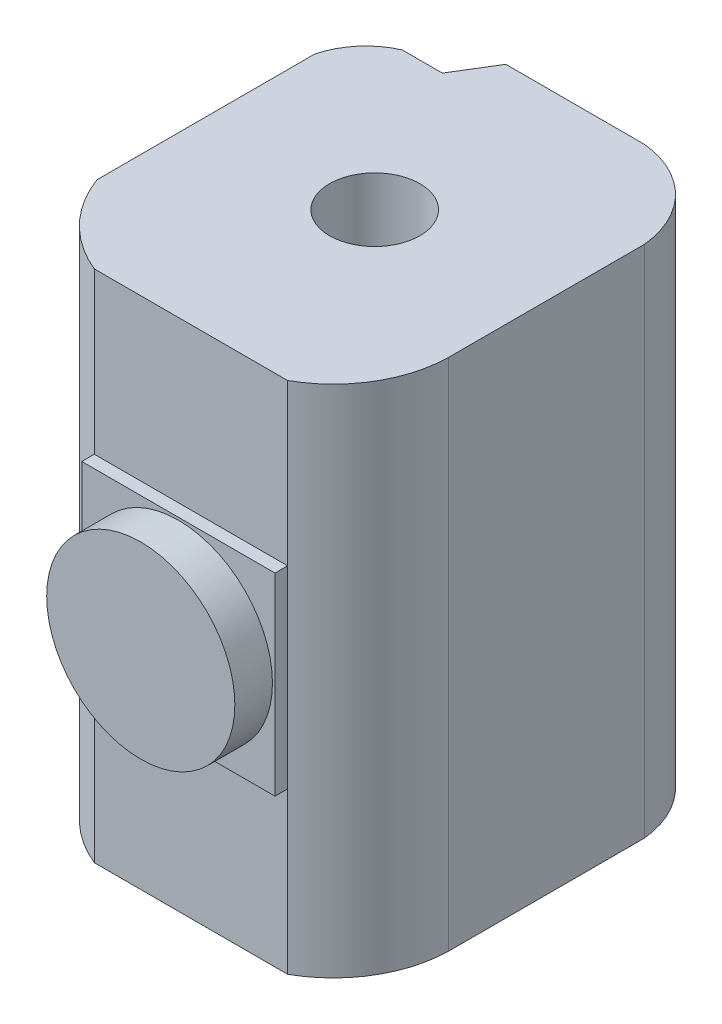
ISO-10303-21;
HEADER;
FILE_DESCRIPTION(('STEP AP214'),'2;1');
FILE_NAME('part.step','',(''),(''),'','','');
FILE_SCHEMA(('AUTOMOTIVE_DESIGN { 1 0 10303 214 1 1 1 1 }'));
ENDSEC;
DATA;
#1=APPLICATION_CONTEXT('core data for automotive mechanical design processes');
#2=APPLICATION_PROTOCOL_DEFINITION('international standard','automotive_design',2000,#1);
#3=PRODUCT_CONTEXT('',#1,'mechanical');
#4=PRODUCT('Part','Part','',(#3));
#5=PRODUCT_RELATED_PRODUCT_CATEGORY('part','',(#4));
#6=PRODUCT_DEFINITION_FORMATION('','',#4);
#7=PRODUCT_DEFINITION_CONTEXT('part definition',#1,'design');
#8=PRODUCT_DEFINITION('design','',#6,#7);
#9=PRODUCT_DEFINITION_SHAPE('','',#8);
#10=(LENGTH_UNIT() NAMED_UNIT(*) SI_UNIT(.MILLI.,.METRE.));
#11=(NAMED_UNIT(*) PLANE_ANGLE_UNIT() SI_UNIT($,.RADIAN.));
#12=(NAMED_UNIT(*) SI_UNIT($,.STERADIAN.) SOLID_ANGLE_UNIT());
#13=UNCERTAINTY_MEASURE_WITH_UNIT(LENGTH_MEASURE(1.E-05),#10,'distance_accuracy_value','');
#14=(GEOMETRIC_REPRESENTATION_CONTEXT(3) GLOBAL_UNCERTAINTY_ASSIGNED_CONTEXT((#13)) GLOBAL_UNIT_ASSIGNED_CONTEXT((#10,
#11,#12)) REPRESENTATION_CONTEXT('',''));
#15=CARTESIAN_POINT('',(0.,0.,0.));
#16=DIRECTION('',(0.,0.,1.));
#17=DIRECTION('',(1.,0.,0.));
#18=AXIS2_PLACEMENT_3D('',#15,#16,#17);
#19=CARTESIAN_POINT('',(-131.4,410.,152.64));
#20=DIRECTION('',(0.,0.,-1.));
#21=DIRECTION('',(-1.,0.,0.));
#22=AXIS2_PLACEMENT_3D('',#19,#20,#21);
#23=PLANE('',#22);
#24=DIRECTION('',(1.,0.,0.));
#25=VECTOR('',#24,1.);
#26=CARTESIAN_POINT('',(-70.92,127.96,152.64));
#27=LINE('',#26,#25);
#28=CARTESIAN_POINT('',(-70.92,127.96,152.64));
#29=VERTEX_POINT('',#28);
#30=CARTESIAN_POINT('',(83.16,127.96,152.64));
#31=VERTEX_POINT('',#30);
#32=EDGE_CURVE('E55',#29,#31,#27,.T.);
#33=ORIENTED_EDGE('',*,*,#32,.F.);
#34=DIRECTION('',(0.,1.,0.));
#35=VECTOR('',#34,1.);
#36=CARTESIAN_POINT('',(-70.92,0.,152.64));
#37=LINE('',#36,#35);
#38=CARTESIAN_POINT('',(-70.92,0.,152.64));
#39=VERTEX_POINT('',#38);
#40=EDGE_CURVE('E217',#39,#29,#37,.T.);
#41=ORIENTED_EDGE('',*,*,#40,.F.);
#42=DIRECTION('',(1.,0.,0.));
#43=VECTOR('',#42,1.);
#44=CARTESIAN_POINT('',(-131.4,0.,152.64));
#45=LINE('',#44,#43);
#46=CARTESIAN_POINT('',(83.16,0.,152.64));
#47=VERTEX_POINT('',#46);
#48=EDGE_CURVE('E234',#39,#47,#45,.T.);
#49=ORIENTED_EDGE('',*,*,#48,.T.);
#50=DIRECTION('',(0.,1.,0.));
#51=VECTOR('',#50,1.);
#52=CARTESIAN_POINT('',(83.16,0.,152.64));
#53=LINE('',#52,#51);
#54=EDGE_CURVE('E186',#47,#31,#53,.T.);
#55=ORIENTED_EDGE('',*,*,#54,.T.);
#56=EDGE_LOOP('',(#33,#41,#49,#55));
#57=FACE_BOUND('',#56,.T.);
#58=ADVANCED_FACE('F38',(#57),#23,.F.);
#59=DIRECTION('',(-1.,0.,0.));
#60=VECTOR('',#59,1.);
#61=CARTESIAN_POINT('',(-70.92,282.04,152.64));
#62=LINE('',#61,#60);
#63=CARTESIAN_POINT('',(83.16,282.04,152.64));
#64=VERTEX_POINT('',#63);
#65=CARTESIAN_POINT('',(-70.92,282.04,152.64));
#66=VERTEX_POINT('',#65);
#67=EDGE_CURVE('E63',#64,#66,#62,.T.);
#68=ORIENTED_EDGE('',*,*,#67,.F.);
#69=CARTESIAN_POINT('',(83.16,410.,152.64));
#70=VERTEX_POINT('',#69);
#71=EDGE_CURVE('E185',#64,#70,#53,.T.);
#72=ORIENTED_EDGE('',*,*,#71,.T.);
#73=DIRECTION('',(1.,0.,0.));
#74=VECTOR('',#73,1.);
#75=CARTESIAN_POINT('',(-131.4,410.,152.64));
#76=LINE('',#75,#74);
#77=CARTESIAN_POINT('',(-70.92,410.,152.64));
#78=VERTEX_POINT('',#77);
#79=EDGE_CURVE('E47',#78,#70,#76,.T.);
#80=ORIENTED_EDGE('',*,*,#79,.F.);
#81=EDGE_CURVE('E216',#66,#78,#37,.T.);
#82=ORIENTED_EDGE('',*,*,#81,.F.);
#83=EDGE_LOOP('',(#68,#72,#80,#82));
#84=FACE_BOUND('',#83,.T.);
#85=ADVANCED_FACE('F282',(#84),#23,.F.);
#86=CARTESIAN_POINT('',(0.,410.,0.));
#87=DIRECTION('',(0.,-1.,0.));
#88=DIRECTION('',(0.,0.,-1.));
#89=AXIS2_PLACEMENT_3D('',#86,#87,#88);
#90=PLANE('',#89);
#91=CARTESIAN_POINT('',(0.,410.,0.));
#92=DIRECTION('',(0.,-1.,0.));
#93=DIRECTION('',(0.,0.,-1.));
#94=AXIS2_PLACEMENT_3D('',#91,#92,#93);
#95=CIRCLE('',#94,36.);
#96=CARTESIAN_POINT('',(0.,410.,36.));
#97=VERTEX_POINT('',#96);
#98=EDGE_CURVE('E170',#97,#97,#95,.T.);
#99=ORIENTED_EDGE('',*,*,#98,.T.);
#100=EDGE_LOOP('',(#99));
#101=FACE_BOUND('',#100,.T.);
#102=DIRECTION('',(-1.,0.,0.));
#103=VECTOR('',#102,1.);
#104=CARTESIAN_POINT('',(-131.4,410.,-152.64));
#105=LINE('',#104,#103);
#106=CARTESIAN_POINT('',(62.2799999999994,410.,-152.64));
#107=VERTEX_POINT('',#106);
#108=CARTESIAN_POINT('',(-48.1593420898172,410.,-152.64));
#109=VERTEX_POINT('',#108);
#110=EDGE_CURVE('E233',#107,#109,#105,.T.);
#111=ORIENTED_EDGE('',*,*,#110,.T.);
#112=DIRECTION('',(-0.52196564210467,0.,0.852966510750721));
#113=VECTOR('',#112,1.);
#114=CARTESIAN_POINT('',(-102.996679913968,410.,-63.027947156597));
#115=LINE('',#114,#113);
#116=CARTESIAN_POINT('',(-67.3454683106027,410.,-121.287125754525));
#117=VERTEX_POINT('',#116);
#118=EDGE_CURVE('E226',#109,#117,#115,.T.);
#119=ORIENTED_EDGE('',*,*,#118,.T.);
#120=DIRECTION('',(-1.,0.,0.));
#121=VECTOR('',#120,1.);
#122=CARTESIAN_POINT('',(0.,410.,-121.287125754525));
#123=LINE('',#122,#121);
#124=CARTESIAN_POINT('',(-99.3727341553014,410.,-121.287125754525));
#125=VERTEX_POINT('',#124);
#126=EDGE_CURVE('E223',#117,#125,#123,.T.);
#127=ORIENTED_EDGE('',*,*,#126,.T.);
#128=CARTESIAN_POINT('',(-76.5886532674374,410.,-69.5023380807909));
#129=DIRECTION('',(0.,1.,0.));
#130=DIRECTION('',(0.,0.,1.));
#131=AXIS2_PLACEMENT_3D('',#128,#129,#130);
#132=CIRCLE('',#131,56.5754237838167);
#133=CARTESIAN_POINT('',(-131.4,410.,-83.52));
#134=VERTEX_POINT('',#133);
#135=EDGE_CURVE('E42',#134,#125,#132,.F.);
#136=ORIENTED_EDGE('',*,*,#135,.F.);
#137=DIRECTION('',(0.,0.,1.));
#138=VECTOR('',#137,1.);
#139=CARTESIAN_POINT('',(-131.4,410.,152.64));
#140=LINE('',#139,#138);
#141=CARTESIAN_POINT('',(-131.4,410.,90.));
#142=VERTEX_POINT('',#141);
#143=EDGE_CURVE('E237',#134,#142,#140,.T.);
#144=ORIENTED_EDGE('',*,*,#143,.T.);
#145=CARTESIAN_POINT('',(-30.0902527311731,410.,52.7009336714775));
#146=DIRECTION('',(0.,1.,0.));
#147=DIRECTION('',(0.,0.,1.));
#148=AXIS2_PLACEMENT_3D('',#145,#146,#147);
#149=CIRCLE('',#148,107.957793793005);
#150=EDGE_CURVE('E222',#78,#142,#149,.F.);
#151=ORIENTED_EDGE('',*,*,#150,.F.);
#152=ORIENTED_EDGE('',*,*,#79,.T.);
#153=CARTESIAN_POINT('',(37.7003567408536,410.,70.681476591326));
#154=DIRECTION('',(0.,1.,0.));
#155=DIRECTION('',(0.,0.,1.));
#156=AXIS2_PLACEMENT_3D('',#153,#154,#155);
#157=CIRCLE('',#156,93.721815627841);
#158=CARTESIAN_POINT('',(131.4,410.,72.7200000000003));
#159=VERTEX_POINT('',#158);
#160=EDGE_CURVE('E253',#159,#70,#157,.F.);
#161=ORIENTED_EDGE('',*,*,#160,.F.);
#162=DIRECTION('',(0.,0.,-1.));
#163=VECTOR('',#162,1.);
#164=CARTESIAN_POINT('',(131.4,410.,152.64));
#165=LINE('',#164,#163);
#166=CARTESIAN_POINT('',(131.4,410.,-83.5200000000001));
#167=VERTEX_POINT('',#166);
#168=EDGE_CURVE('E230',#159,#167,#165,.T.);
#169=ORIENTED_EDGE('',*,*,#168,.T.);
#170=CARTESIAN_POINT('',(55.0799999999997,410.,-76.3199999999996));
#171=DIRECTION('',(0.,1.,0.));
#172=DIRECTION('',(0.,0.,1.));
#173=AXIS2_PLACEMENT_3D('',#170,#171,#172);
#174=CIRCLE('',#173,76.6588703282279);
#175=EDGE_CURVE('E255',#107,#167,#174,.F.);
#176=ORIENTED_EDGE('',*,*,#175,.F.);
#177=EDGE_LOOP('',(#111,#119,#127,#136,#144,#151,#152,#161,#169,#176));
#178=FACE_BOUND('',#177,.T.);
#179=ADVANCED_FACE('F266',(#101,#178),#90,.F.);
#180=CARTESIAN_POINT('',(0.,0.,0.));
#181=DIRECTION('',(0.,-1.,0.));
#182=DIRECTION('',(0.,0.,-1.));
#183=AXIS2_PLACEMENT_3D('',#180,#181,#182);
#184=PLANE('',#183);
#185=CARTESIAN_POINT('',(0.,0.,0.));
#186=DIRECTION('',(0.,1.,0.));
#187=DIRECTION('',(0.,0.,1.));
#188=AXIS2_PLACEMENT_3D('',#185,#186,#187);
#189=CIRCLE('',#188,36.);
#190=CARTESIAN_POINT('',(0.,0.,36.));
#191=VERTEX_POINT('',#190);
#192=EDGE_CURVE('E167',#191,#191,#189,.T.);
#193=ORIENTED_EDGE('',*,*,#192,.T.);
#194=EDGE_LOOP('',(#193));
#195=FACE_BOUND('',#194,.T.);
#196=DIRECTION('',(0.52196564210467,0.,-0.852966510750721));
#197=VECTOR('',#196,1.);
#198=CARTESIAN_POINT('',(-67.3454683106027,0.,-121.287125754525));
#199=LINE('',#198,#197);
#200=CARTESIAN_POINT('',(-67.3454683106027,0.,-121.287125754525));
#201=VERTEX_POINT('',#200);
#202=CARTESIAN_POINT('',(-48.1593420898172,0.,-152.64));
#203=VERTEX_POINT('',#202);
#204=EDGE_CURVE('E202',#201,#203,#199,.T.);
#205=ORIENTED_EDGE('',*,*,#204,.T.);
#206=DIRECTION('',(-1.,0.,0.));
#207=VECTOR('',#206,1.);
#208=CARTESIAN_POINT('',(-131.4,0.,-152.64));
#209=LINE('',#208,#207);
#210=CARTESIAN_POINT('',(62.2799999999992,0.,-152.64));
#211=VERTEX_POINT('',#210);
#212=EDGE_CURVE('E244',#211,#203,#209,.T.);
#213=ORIENTED_EDGE('',*,*,#212,.F.);
#214=CARTESIAN_POINT('',(55.0799999999997,0.,-76.3199999999996));
#215=DIRECTION('',(0.,-1.,0.));
#216=DIRECTION('',(0.,0.,-1.));
#217=AXIS2_PLACEMENT_3D('',#214,#215,#216);
#218=CIRCLE('',#217,76.6588703282279);
#219=CARTESIAN_POINT('',(131.4,0.,-83.52));
#220=VERTEX_POINT('',#219);
#221=EDGE_CURVE('E189',#211,#220,#218,.T.);
#222=ORIENTED_EDGE('',*,*,#221,.T.);
#223=DIRECTION('',(0.,0.,-1.));
#224=VECTOR('',#223,1.);
#225=CARTESIAN_POINT('',(131.4,0.,152.64));
#226=LINE('',#225,#224);
#227=CARTESIAN_POINT('',(131.4,0.,72.72));
#228=VERTEX_POINT('',#227);
#229=EDGE_CURVE('E229',#228,#220,#226,.T.);
#230=ORIENTED_EDGE('',*,*,#229,.F.);
#231=CARTESIAN_POINT('',(37.7003567408536,0.,70.681476591326));
#232=DIRECTION('',(0.,-1.,0.));
#233=DIRECTION('',(0.,0.,1.));
#234=AXIS2_PLACEMENT_3D('',#231,#232,#233);
#235=CIRCLE('',#234,93.721815627841);
#236=EDGE_CURVE('E179',#228,#47,#235,.T.);
#237=ORIENTED_EDGE('',*,*,#236,.T.);
#238=ORIENTED_EDGE('',*,*,#48,.F.);
#239=CARTESIAN_POINT('',(-30.0902527311731,0.,52.7009336714775));
#240=DIRECTION('',(0.,-1.,0.));
#241=DIRECTION('',(0.,0.,-1.));
#242=AXIS2_PLACEMENT_3D('',#239,#240,#241);
#243=CIRCLE('',#242,107.957793793005);
#244=CARTESIAN_POINT('',(-131.4,0.,90.));
#245=VERTEX_POINT('',#244);
#246=EDGE_CURVE('E188',#39,#245,#243,.T.);
#247=ORIENTED_EDGE('',*,*,#246,.T.);
#248=DIRECTION('',(0.,0.,1.));
#249=VECTOR('',#248,1.);
#250=CARTESIAN_POINT('',(-131.4,0.,152.64));
#251=LINE('',#250,#249);
#252=CARTESIAN_POINT('',(-131.4,0.,-83.52));
#253=VERTEX_POINT('',#252);
#254=EDGE_CURVE('E247',#253,#245,#251,.T.);
#255=ORIENTED_EDGE('',*,*,#254,.F.);
#256=CARTESIAN_POINT('',(-76.5886532674374,0.,-69.5023380807909));
#257=DIRECTION('',(0.,-1.,0.));
#258=DIRECTION('',(0.,0.,-1.));
#259=AXIS2_PLACEMENT_3D('',#256,#257,#258);
#260=CIRCLE('',#259,56.5754237838167);
#261=CARTESIAN_POINT('',(-99.3727341553014,0.,-121.287125754525));
#262=VERTEX_POINT('',#261);
#263=EDGE_CURVE('E178',#253,#262,#260,.T.);
#264=ORIENTED_EDGE('',*,*,#263,.T.);
#265=DIRECTION('',(1.,0.,0.));
#266=VECTOR('',#265,1.);
#267=CARTESIAN_POINT('',(-99.3727341553014,0.,-121.287125754525));
#268=LINE('',#267,#266);
#269=EDGE_CURVE('E199',#262,#201,#268,.T.);
#270=ORIENTED_EDGE('',*,*,#269,.T.);
#271=EDGE_LOOP('',(#205,#213,#222,#230,#237,#238,#247,#255,#264,#270));
#272=FACE_BOUND('',#271,.T.);
#273=ADVANCED_FACE('F274',(#195,#272),#184,.T.);
#274=CARTESIAN_POINT('',(131.4,410.,152.64));
#275=DIRECTION('',(-1.,0.,0.));
#276=DIRECTION('',(0.,0.,1.));
#277=AXIS2_PLACEMENT_3D('',#274,#275,#276);
#278=PLANE('',#277);
#279=ORIENTED_EDGE('',*,*,#229,.T.);
#280=DIRECTION('',(0.,1.,0.));
#281=VECTOR('',#280,1.);
#282=CARTESIAN_POINT('',(131.4,0.,-83.52));
#283=LINE('',#282,#281);
#284=EDGE_CURVE('E192',#220,#167,#283,.T.);
#285=ORIENTED_EDGE('',*,*,#284,.T.);
#286=ORIENTED_EDGE('',*,*,#168,.F.);
#287=DIRECTION('',(0.,1.,0.));
#288=VECTOR('',#287,1.);
#289=CARTESIAN_POINT('',(131.4,0.,72.72));
#290=LINE('',#289,#288);
#291=EDGE_CURVE('E182',#228,#159,#290,.T.);
#292=ORIENTED_EDGE('',*,*,#291,.F.);
#293=EDGE_LOOP('',(#279,#285,#286,#292));
#294=FACE_BOUND('',#293,.T.);
#295=ADVANCED_FACE('F40',(#294),#278,.F.);
#296=CARTESIAN_POINT('',(-131.4,410.,-152.64));
#297=DIRECTION('',(0.,0.,1.));
#298=DIRECTION('',(1.,0.,0.));
#299=AXIS2_PLACEMENT_3D('',#296,#297,#298);
#300=PLANE('',#299);
#301=ORIENTED_EDGE('',*,*,#212,.T.);
#302=DIRECTION('',(0.,1.,0.));
#303=VECTOR('',#302,1.);
#304=CARTESIAN_POINT('',(-48.1593420898172,0.,-152.64));
#305=LINE('',#304,#303);
#306=EDGE_CURVE('E193',#203,#109,#305,.T.);
#307=ORIENTED_EDGE('',*,*,#306,.T.);
#308=ORIENTED_EDGE('',*,*,#110,.F.);
#309=DIRECTION('',(0.,1.,0.));
#310=VECTOR('',#309,1.);
#311=CARTESIAN_POINT('',(62.2799999999992,0.,-152.64));
#312=LINE('',#311,#310);
#313=EDGE_CURVE('E183',#211,#107,#312,.T.);
#314=ORIENTED_EDGE('',*,*,#313,.F.);
#315=EDGE_LOOP('',(#301,#307,#308,#314));
#316=FACE_BOUND('',#315,.T.);
#317=ADVANCED_FACE('F292',(#316),#300,.F.);
#318=CARTESIAN_POINT('',(-131.4,410.,152.64));
#319=DIRECTION('',(1.,0.,0.));
#320=DIRECTION('',(0.,0.,-1.));
#321=AXIS2_PLACEMENT_3D('',#318,#319,#320);
#322=PLANE('',#321);
#323=ORIENTED_EDGE('',*,*,#143,.F.);
#324=DIRECTION('',(0.,1.,0.));
#325=VECTOR('',#324,1.);
#326=CARTESIAN_POINT('',(-131.4,0.,-83.52));
#327=LINE('',#326,#325);
#328=EDGE_CURVE('E205',#253,#134,#327,.T.);
#329=ORIENTED_EDGE('',*,*,#328,.F.);
#330=ORIENTED_EDGE('',*,*,#254,.T.);
#331=DIRECTION('',(0.,1.,0.));
#332=VECTOR('',#331,1.);
#333=CARTESIAN_POINT('',(-131.4,0.,90.));
#334=LINE('',#333,#332);
#335=EDGE_CURVE('E219',#245,#142,#334,.T.);
#336=ORIENTED_EDGE('',*,*,#335,.T.);
#337=EDGE_LOOP('',(#323,#329,#330,#336));
#338=FACE_BOUND('',#337,.T.);
#339=ADVANCED_FACE('F277',(#338),#322,.F.);
#340=CARTESIAN_POINT('',(-30.0902527311731,0.,52.7009336714775));
#341=DIRECTION('',(0.,1.,0.));
#342=DIRECTION('',(0.,0.,1.));
#343=AXIS2_PLACEMENT_3D('',#340,#341,#342);
#344=CYLINDRICAL_SURFACE('',#343,107.957793793005);
#345=ORIENTED_EDGE('',*,*,#335,.F.);
#346=ORIENTED_EDGE('',*,*,#246,.F.);
#347=ORIENTED_EDGE('',*,*,#40,.T.);
#348=DIRECTION('',(0.,-1.,0.));
#349=VECTOR('',#348,1.);
#350=CARTESIAN_POINT('',(-70.92,127.96,152.64));
#351=LINE('',#350,#349);
#352=EDGE_CURVE('E364',#66,#29,#351,.T.);
#353=ORIENTED_EDGE('',*,*,#352,.F.);
#354=ORIENTED_EDGE('',*,*,#81,.T.);
#355=ORIENTED_EDGE('',*,*,#150,.T.);
#356=EDGE_LOOP('',(#345,#346,#347,#353,#354,#355));
#357=FACE_BOUND('',#356,.T.);
#358=ADVANCED_FACE('F299',(#357),#344,.T.);
#359=CARTESIAN_POINT('',(37.7003567408536,0.,70.681476591326));
#360=DIRECTION('',(0.,1.,0.));
#361=DIRECTION('',(0.,0.,1.));
#362=AXIS2_PLACEMENT_3D('',#359,#360,#361);
#363=CYLINDRICAL_SURFACE('',#362,93.721815627841);
#364=ORIENTED_EDGE('',*,*,#54,.F.);
#365=ORIENTED_EDGE('',*,*,#236,.F.);
#366=ORIENTED_EDGE('',*,*,#291,.T.);
#367=ORIENTED_EDGE('',*,*,#160,.T.);
#368=ORIENTED_EDGE('',*,*,#71,.F.);
#369=DIRECTION('',(0.,1.,0.));
#370=VECTOR('',#369,1.);
#371=CARTESIAN_POINT('',(83.16,127.96,152.64));
#372=LINE('',#371,#370);
#373=EDGE_CURVE('E166',#31,#64,#372,.T.);
#374=ORIENTED_EDGE('',*,*,#373,.F.);
#375=EDGE_LOOP('',(#364,#365,#366,#367,#368,#374));
#376=FACE_BOUND('',#375,.T.);
#377=ADVANCED_FACE('F284',(#376),#363,.T.);
#378=CARTESIAN_POINT('',(55.0799999999997,0.,-76.3199999999996));
#379=DIRECTION('',(0.,1.,0.));
#380=DIRECTION('',(0.,0.,1.));
#381=AXIS2_PLACEMENT_3D('',#378,#379,#380);
#382=CYLINDRICAL_SURFACE('',#381,76.6588703282279);
#383=ORIENTED_EDGE('',*,*,#284,.F.);
#384=ORIENTED_EDGE('',*,*,#221,.F.);
#385=ORIENTED_EDGE('',*,*,#313,.T.);
#386=ORIENTED_EDGE('',*,*,#175,.T.);
#387=EDGE_LOOP('',(#383,#384,#385,#386));
#388=FACE_BOUND('',#387,.T.);
#389=ADVANCED_FACE('F289',(#388),#382,.T.);
#390=CARTESIAN_POINT('',(-67.3454683106027,0.,-121.287125754525));
#391=DIRECTION('',(0.852966510750721,0.,0.52196564210467));
#392=DIRECTION('',(0.52196564210467,0.,-0.852966510750721));
#393=AXIS2_PLACEMENT_3D('',#390,#391,#392);
#394=PLANE('',#393);
#395=ORIENTED_EDGE('',*,*,#306,.F.);
#396=ORIENTED_EDGE('',*,*,#204,.F.);
#397=DIRECTION('',(0.,1.,0.));
#398=VECTOR('',#397,1.);
#399=CARTESIAN_POINT('',(-67.3454683106027,0.,-121.287125754525));
#400=LINE('',#399,#398);
#401=EDGE_CURVE('E208',#201,#117,#400,.T.);
#402=ORIENTED_EDGE('',*,*,#401,.T.);
#403=ORIENTED_EDGE('',*,*,#118,.F.);
#404=EDGE_LOOP('',(#395,#396,#402,#403));
#405=FACE_BOUND('',#404,.T.);
#406=ADVANCED_FACE('F271',(#405),#394,.F.);
#407=CARTESIAN_POINT('',(-99.3727341553014,0.,-121.287125754525));
#408=DIRECTION('',(0.,0.,1.));
#409=DIRECTION('',(1.,0.,0.));
#410=AXIS2_PLACEMENT_3D('',#407,#408,#409);
#411=PLANE('',#410);
#412=ORIENTED_EDGE('',*,*,#401,.F.);
#413=ORIENTED_EDGE('',*,*,#269,.F.);
#414=DIRECTION('',(0.,1.,0.));
#415=VECTOR('',#414,1.);
#416=CARTESIAN_POINT('',(-99.3727341553014,0.,-121.287125754525));
#417=LINE('',#416,#415);
#418=EDGE_CURVE('E211',#262,#125,#417,.T.);
#419=ORIENTED_EDGE('',*,*,#418,.T.);
#420=ORIENTED_EDGE('',*,*,#126,.F.);
#421=EDGE_LOOP('',(#412,#413,#419,#420));
#422=FACE_BOUND('',#421,.T.);
#423=ADVANCED_FACE('F268',(#422),#411,.F.);
#424=CARTESIAN_POINT('',(-76.5886532674374,0.,-69.5023380807909));
#425=DIRECTION('',(0.,1.,0.));
#426=DIRECTION('',(0.,0.,1.));
#427=AXIS2_PLACEMENT_3D('',#424,#425,#426);
#428=CYLINDRICAL_SURFACE('',#427,56.5754237838167);
#429=ORIENTED_EDGE('',*,*,#418,.F.);
#430=ORIENTED_EDGE('',*,*,#263,.F.);
#431=ORIENTED_EDGE('',*,*,#328,.T.);
#432=ORIENTED_EDGE('',*,*,#135,.T.);
#433=EDGE_LOOP('',(#429,#430,#431,#432));
#434=FACE_BOUND('',#433,.T.);
#435=ADVANCED_FACE('F262',(#434),#428,.T.);
#436=CARTESIAN_POINT('',(0.,0.,0.));
#437=DIRECTION('',(0.,1.,0.));
#438=DIRECTION('',(0.,0.,1.));
#439=AXIS2_PLACEMENT_3D('',#436,#437,#438);
#440=CYLINDRICAL_SURFACE('',#439,36.);
#441=CARTESIAN_POINT('',(0.,0.,36.));
#442=CARTESIAN_POINT('',(0.,4.27083333333332,36.));
#443=CARTESIAN_POINT('',(0.,8.54166666666666,36.));
#444=CARTESIAN_POINT('',(0.,17.0833333333333,36.));
#445=CARTESIAN_POINT('',(0.,21.3541666666667,36.));
#446=CARTESIAN_POINT('',(0.,29.8958333333333,36.));
#447=CARTESIAN_POINT('',(0.,34.1666666666667,36.));
#448=CARTESIAN_POINT('',(0.,42.7083333333333,36.));
#449=CARTESIAN_POINT('',(0.,46.9791666666667,36.));
#450=CARTESIAN_POINT('',(0.,55.5208333333333,36.));
#451=CARTESIAN_POINT('',(0.,59.7916666666667,36.));
#452=CARTESIAN_POINT('',(0.,68.3333333333333,36.));
#453=CARTESIAN_POINT('',(0.,72.6041666666667,36.));
#454=CARTESIAN_POINT('',(0.,81.1458333333333,36.));
#455=CARTESIAN_POINT('',(0.,85.4166666666667,36.));
#456=CARTESIAN_POINT('',(0.,93.9583333333333,36.));
#457=CARTESIAN_POINT('',(0.,98.2291666666667,36.));
#458=CARTESIAN_POINT('',(0.,106.770833333333,36.));
#459=CARTESIAN_POINT('',(0.,111.041666666667,36.));
#460=CARTESIAN_POINT('',(0.,119.583333333333,36.));
#461=CARTESIAN_POINT('',(0.,123.854166666667,36.));
#462=CARTESIAN_POINT('',(0.,132.395833333333,36.));
#463=CARTESIAN_POINT('',(0.,136.666666666667,36.));
#464=CARTESIAN_POINT('',(0.,145.208333333333,36.));
#465=CARTESIAN_POINT('',(0.,149.479166666667,36.));
#466=CARTESIAN_POINT('',(0.,158.020833333333,36.));
#467=CARTESIAN_POINT('',(0.,162.291666666667,36.));
#468=CARTESIAN_POINT('',(0.,170.833333333333,36.));
#469=CARTESIAN_POINT('',(0.,175.104166666667,36.));
#470=CARTESIAN_POINT('',(0.,183.645833333333,36.));
#471=CARTESIAN_POINT('',(0.,187.916666666667,36.));
#472=CARTESIAN_POINT('',(0.,196.458333333333,36.));
#473=CARTESIAN_POINT('',(0.,200.729166666667,36.));
#474=CARTESIAN_POINT('',(0.,209.270833333333,36.));
#475=CARTESIAN_POINT('',(0.,213.541666666667,36.));
#476=CARTESIAN_POINT('',(0.,222.083333333333,36.));
#477=CARTESIAN_POINT('',(0.,226.354166666667,36.));
#478=CARTESIAN_POINT('',(0.,234.895833333333,36.));
#479=CARTESIAN_POINT('',(0.,239.166666666667,36.));
#480=CARTESIAN_POINT('',(0.,247.708333333333,36.));
#481=CARTESIAN_POINT('',(0.,251.979166666667,36.));
#482=CARTESIAN_POINT('',(0.,260.520833333333,36.));
#483=CARTESIAN_POINT('',(0.,264.791666666667,36.));
#484=CARTESIAN_POINT('',(0.,273.333333333333,36.));
#485=CARTESIAN_POINT('',(0.,277.604166666667,36.));
#486=CARTESIAN_POINT('',(0.,286.145833333333,36.));
#487=CARTESIAN_POINT('',(0.,290.416666666667,36.));
#488=CARTESIAN_POINT('',(0.,298.958333333333,36.));
#489=CARTESIAN_POINT('',(0.,303.229166666667,36.));
#490=CARTESIAN_POINT('',(0.,311.770833333333,36.));
#491=CARTESIAN_POINT('',(0.,316.041666666667,36.));
#492=CARTESIAN_POINT('',(0.,324.583333333333,36.));
#493=CARTESIAN_POINT('',(0.,328.854166666667,36.));
#494=CARTESIAN_POINT('',(0.,337.395833333333,36.));
#495=CARTESIAN_POINT('',(0.,341.666666666667,36.));
#496=CARTESIAN_POINT('',(0.,350.208333333333,36.));
#497=CARTESIAN_POINT('',(0.,354.479166666667,36.));
#498=CARTESIAN_POINT('',(0.,363.020833333333,36.));
#499=CARTESIAN_POINT('',(0.,367.291666666667,36.));
#500=CARTESIAN_POINT('',(0.,375.833333333333,36.));
#501=CARTESIAN_POINT('',(0.,380.104166666667,36.));
#502=CARTESIAN_POINT('',(0.,388.645833333333,36.));
#503=CARTESIAN_POINT('',(0.,392.916666666667,36.));
#504=CARTESIAN_POINT('',(0.,401.458333333333,36.));
#505=CARTESIAN_POINT('',(0.,405.729166666667,36.));
#506=CARTESIAN_POINT('',(0.,410.,36.));
#507=B_SPLINE_CURVE_WITH_KNOTS('',3,(#441,#442,#443,#444,#445,#446,#447,#448,#449,#450,#451,
#452,#453,#454,#455,#456,#457,#458,#459,#460,#461,#462,#463,#464,#465,#466,#467,#468,#469,#470,
#471,#472,#473,#474,#475,#476,#477,#478,#479,#480,#481,#482,#483,#484,#485,#486,#487,#488,#489,
#490,#491,#492,#493,#494,#495,#496,#497,#498,#499,#500,#501,#502,#503,#504,#505,#506),
.UNSPECIFIED.,.F.,.F.,(4,2,2,2,2,2,2,2,2,2,2,2,2,2,2,2,2,2,2,2,2,2,2,2,2,2,2,2,2,2,2,2,4),(0.,
12.8125,25.625,38.4375,51.25,64.0625,76.875,89.6875,102.5,115.3125,128.125,140.9375,153.75,
166.5625,179.375,192.1875,205.,217.8125,230.625,243.4375,256.25,269.0625,281.875,294.6875,307.5,
320.3125,333.125,345.9375,358.75,371.5625,384.375,397.1875,410.),.UNSPECIFIED.);
#508=EDGE_CURVE('BSEAM318',#191,#97,#507,.T.);
#509=ORIENTED_EDGE('',*,*,#192,.F.);
#510=ORIENTED_EDGE('',*,*,#98,.F.);
#511=ORIENTED_EDGE('',*,*,#508,.T.);
#512=ORIENTED_EDGE('',*,*,#508,.F.);
#513=EDGE_LOOP('',(#509,#511,#510,#512));
#514=FACE_BOUND('',#513,.T.);
#515=ADVANCED_FACE('F318',(#514),#440,.F.);
#516=CARTESIAN_POINT('',(83.16,127.96,162.64));
#517=DIRECTION('',(-1.,0.,0.));
#518=DIRECTION('',(0.,-1.,0.));
#519=AXIS2_PLACEMENT_3D('',#516,#517,#518);
#520=PLANE('',#519);
#521=ORIENTED_EDGE('',*,*,#373,.T.);
#522=DIRECTION('',(0.,0.,-1.));
#523=VECTOR('',#522,1.);
#524=CARTESIAN_POINT('',(83.16,282.04,162.64));
#525=LINE('',#524,#523);
#526=CARTESIAN_POINT('',(83.16,282.04,162.64));
#527=VERTEX_POINT('',#526);
#528=EDGE_CURVE('E148',#527,#64,#525,.T.);
#529=ORIENTED_EDGE('',*,*,#528,.F.);
#530=DIRECTION('',(0.,1.,0.));
#531=VECTOR('',#530,1.);
#532=CARTESIAN_POINT('',(83.16,127.96,162.64));
#533=LINE('',#532,#531);
#534=CARTESIAN_POINT('',(83.16,127.96,162.64));
#535=VERTEX_POINT('',#534);
#536=EDGE_CURVE('E155',#535,#527,#533,.T.);
#537=ORIENTED_EDGE('',*,*,#536,.F.);
#538=DIRECTION('',(0.,0.,-1.));
#539=VECTOR('',#538,1.);
#540=CARTESIAN_POINT('',(83.16,127.96,162.64));
#541=LINE('',#540,#539);
#542=EDGE_CURVE('E361',#535,#31,#541,.T.);
#543=ORIENTED_EDGE('',*,*,#542,.T.);
#544=EDGE_LOOP('',(#521,#529,#537,#543));
#545=FACE_BOUND('',#544,.T.);
#546=ADVANCED_FACE('F165',(#545),#520,.F.);
#547=CARTESIAN_POINT('',(-70.92,282.04,162.64));
#548=DIRECTION('',(0.,-1.,0.));
#549=DIRECTION('',(0.,0.,-1.));
#550=AXIS2_PLACEMENT_3D('',#547,#548,#549);
#551=PLANE('',#550);
#552=ORIENTED_EDGE('',*,*,#67,.T.);
#553=DIRECTION('',(0.,0.,-1.));
#554=VECTOR('',#553,1.);
#555=CARTESIAN_POINT('',(-70.92,282.04,162.64));
#556=LINE('',#555,#554);
#557=CARTESIAN_POINT('',(-70.92,282.04,162.64));
#558=VERTEX_POINT('',#557);
#559=EDGE_CURVE('E151',#558,#66,#556,.T.);
#560=ORIENTED_EDGE('',*,*,#559,.F.);
#561=DIRECTION('',(-1.,0.,0.));
#562=VECTOR('',#561,1.);
#563=CARTESIAN_POINT('',(-70.92,282.04,162.64));
#564=LINE('',#563,#562);
#565=EDGE_CURVE('E144',#527,#558,#564,.T.);
#566=ORIENTED_EDGE('',*,*,#565,.F.);
#567=ORIENTED_EDGE('',*,*,#528,.T.);
#568=EDGE_LOOP('',(#552,#560,#566,#567));
#569=FACE_BOUND('',#568,.T.);
#570=ADVANCED_FACE('F146',(#569),#551,.F.);
#571=CARTESIAN_POINT('',(-70.92,127.96,162.64));
#572=DIRECTION('',(1.,0.,0.));
#573=DIRECTION('',(0.,0.,-1.));
#574=AXIS2_PLACEMENT_3D('',#571,#572,#573);
#575=PLANE('',#574);
#576=ORIENTED_EDGE('',*,*,#352,.T.);
#577=DIRECTION('',(0.,0.,-1.));
#578=VECTOR('',#577,1.);
#579=CARTESIAN_POINT('',(-70.92,127.96,162.64));
#580=LINE('',#579,#578);
#581=CARTESIAN_POINT('',(-70.92,127.96,162.64));
#582=VERTEX_POINT('',#581);
#583=EDGE_CURVE('E172',#582,#29,#580,.T.);
#584=ORIENTED_EDGE('',*,*,#583,.F.);
#585=DIRECTION('',(0.,-1.,0.));
#586=VECTOR('',#585,1.);
#587=CARTESIAN_POINT('',(-70.92,127.96,162.64));
#588=LINE('',#587,#586);
#589=EDGE_CURVE('E154',#558,#582,#588,.T.);
#590=ORIENTED_EDGE('',*,*,#589,.F.);
#591=ORIENTED_EDGE('',*,*,#559,.T.);
#592=EDGE_LOOP('',(#576,#584,#590,#591));
#593=FACE_BOUND('',#592,.T.);
#594=ADVANCED_FACE('F334',(#593),#575,.F.);
#595=CARTESIAN_POINT('',(-70.92,127.96,162.64));
#596=DIRECTION('',(0.,1.,0.));
#597=DIRECTION('',(0.,0.,1.));
#598=AXIS2_PLACEMENT_3D('',#595,#596,#597);
#599=PLANE('',#598);
#600=ORIENTED_EDGE('',*,*,#32,.T.);
#601=ORIENTED_EDGE('',*,*,#542,.F.);
#602=DIRECTION('',(1.,0.,0.));
#603=VECTOR('',#602,1.);
#604=CARTESIAN_POINT('',(-70.92,127.96,162.64));
#605=LINE('',#604,#603);
#606=EDGE_CURVE('E160',#582,#535,#605,.T.);
#607=ORIENTED_EDGE('',*,*,#606,.F.);
#608=ORIENTED_EDGE('',*,*,#583,.T.);
#609=EDGE_LOOP('',(#600,#601,#607,#608));
#610=FACE_BOUND('',#609,.T.);
#611=ADVANCED_FACE('F337',(#610),#599,.F.);
#612=CARTESIAN_POINT('',(0.,0.,162.64));
#613=DIRECTION('',(0.,0.,-1.));
#614=DIRECTION('',(-1.,0.,0.));
#615=AXIS2_PLACEMENT_3D('',#612,#613,#614);
#616=PLANE('',#615);
#617=CARTESIAN_POINT('',(6.11999999999997,205.,162.64));
#618=DIRECTION('',(0.,0.,1.));
#619=DIRECTION('',(1.,0.,0.));
#620=AXIS2_PLACEMENT_3D('',#617,#618,#619);
#621=CIRCLE('',#620,75.);
#622=CARTESIAN_POINT('',(81.12,205.,162.64));
#623=VERTEX_POINT('',#622);
#624=EDGE_CURVE('E11',#623,#623,#621,.T.);
#625=ORIENTED_EDGE('',*,*,#624,.F.);
#626=EDGE_LOOP('',(#625));
#627=FACE_BOUND('',#626,.T.);
#628=ORIENTED_EDGE('',*,*,#536,.T.);
#629=ORIENTED_EDGE('',*,*,#565,.T.);
#630=ORIENTED_EDGE('',*,*,#589,.T.);
#631=ORIENTED_EDGE('',*,*,#606,.T.);
#632=EDGE_LOOP('',(#628,#629,#630,#631));
#633=FACE_BOUND('',#632,.T.);
#634=ADVANCED_FACE('F158',(#627,#633),#616,.F.);
#635=CARTESIAN_POINT('',(6.11999999999997,205.,192.64));
#636=DIRECTION('',(0.,0.,-1.));
#637=DIRECTION('',(-1.,0.,0.));
#638=AXIS2_PLACEMENT_3D('',#635,#636,#637);
#639=CYLINDRICAL_SURFACE('',#638,75.);
#640=CARTESIAN_POINT('',(6.11999999999997,205.,192.64));
#641=DIRECTION('',(0.,0.,1.));
#642=DIRECTION('',(1.,0.,0.));
#643=AXIS2_PLACEMENT_3D('',#640,#641,#642);
#644=CIRCLE('',#643,75.);
#645=CARTESIAN_POINT('',(81.12,205.,192.64));
#646=VERTEX_POINT('',#645);
#647=EDGE_CURVE('E356',#646,#646,#644,.T.);
#648=ORIENTED_EDGE('',*,*,#647,.F.);
#649=EDGE_LOOP('',(#648));
#650=FACE_BOUND('',#649,.T.);
#651=ORIENTED_EDGE('',*,*,#624,.T.);
#652=EDGE_LOOP('',(#651));
#653=FACE_BOUND('',#652,.T.);
#654=ADVANCED_FACE('F344',(#650,#653),#639,.T.);
#655=CARTESIAN_POINT('',(6.11999999999997,205.,192.64));
#656=DIRECTION('',(0.,0.,1.));
#657=DIRECTION('',(1.,0.,0.));
#658=AXIS2_PLACEMENT_3D('',#655,#656,#657);
#659=PLANE('',#658);
#660=ORIENTED_EDGE('',*,*,#647,.T.);
#661=EDGE_LOOP('',(#660));
#662=FACE_BOUND('',#661,.T.);
#663=ADVANCED_FACE('F348',(#662),#659,.T.);
#664=CLOSED_SHELL('',(#58,#85,#179,#273,#295,#317,#339,#358,#377,#389,#406,#423,#435,#515,#546,
#570,#594,#611,#634,#654,#663));
#665=MANIFOLD_SOLID_BREP('B2',#664);
#666=ADVANCED_BREP_SHAPE_REPRESENTATION('',(#18,#665),#14);
#667=SHAPE_DEFINITION_REPRESENTATION(#9,#666);
ENDSEC;
END-ISO-10303-21;
